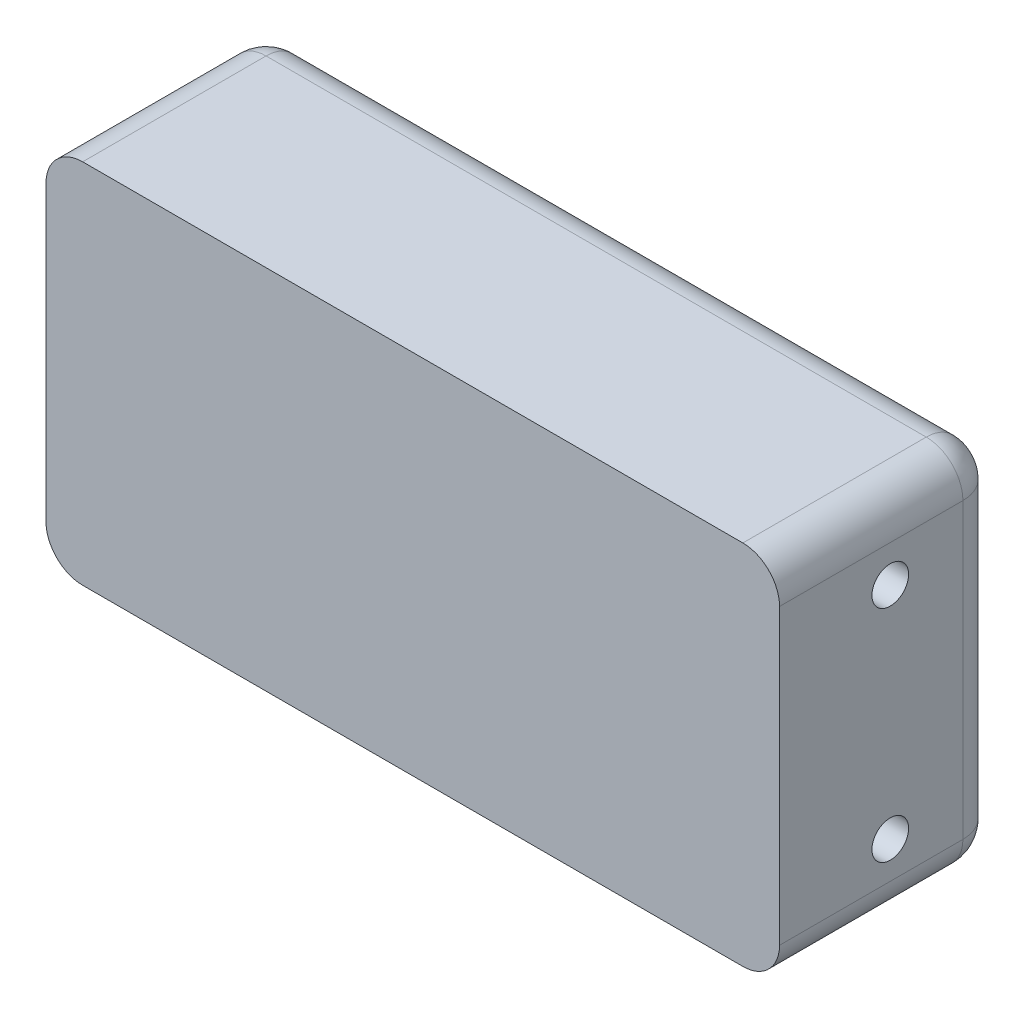
ISO-10303-21;
HEADER;
FILE_DESCRIPTION(('STEP AP214'),'2;1');
FILE_NAME('part.step','',(''),(''),'','','');
FILE_SCHEMA(('AUTOMOTIVE_DESIGN { 1 0 10303 214 1 1 1 1 }'));
ENDSEC;
DATA;
#1=APPLICATION_CONTEXT('core data for automotive mechanical design processes');
#2=APPLICATION_PROTOCOL_DEFINITION('international standard','automotive_design',2000,#1);
#3=PRODUCT_CONTEXT('',#1,'mechanical');
#4=PRODUCT('Part','Part','',(#3));
#5=PRODUCT_RELATED_PRODUCT_CATEGORY('part','',(#4));
#6=PRODUCT_DEFINITION_FORMATION('','',#4);
#7=PRODUCT_DEFINITION_CONTEXT('part definition',#1,'design');
#8=PRODUCT_DEFINITION('design','',#6,#7);
#9=PRODUCT_DEFINITION_SHAPE('','',#8);
#10=(LENGTH_UNIT() NAMED_UNIT(*) SI_UNIT(.MILLI.,.METRE.));
#11=(NAMED_UNIT(*) PLANE_ANGLE_UNIT() SI_UNIT($,.RADIAN.));
#12=(NAMED_UNIT(*) SI_UNIT($,.STERADIAN.) SOLID_ANGLE_UNIT());
#13=UNCERTAINTY_MEASURE_WITH_UNIT(LENGTH_MEASURE(1.E-05),#10,'distance_accuracy_value','');
#14=(GEOMETRIC_REPRESENTATION_CONTEXT(3) GLOBAL_UNCERTAINTY_ASSIGNED_CONTEXT((#13)) GLOBAL_UNIT_ASSIGNED_CONTEXT((#10,
#11,#12)) REPRESENTATION_CONTEXT('',''));
#15=CARTESIAN_POINT('',(0.,0.,0.));
#16=DIRECTION('',(0.,0.,1.));
#17=DIRECTION('',(1.,0.,0.));
#18=AXIS2_PLACEMENT_3D('',#15,#16,#17);
#19=CARTESIAN_POINT('',(50.,25.,30.));
#20=DIRECTION('',(-1.,0.,0.));
#21=DIRECTION('',(0.,-1.,0.));
#22=AXIS2_PLACEMENT_3D('',#19,#20,#21);
#23=PLANE('',#22);
#24=CARTESIAN_POINT('',(50.,-15.,14.9035489173353));
#25=DIRECTION('',(1.,0.,0.));
#26=DIRECTION('',(0.,1.,0.));
#27=AXIS2_PLACEMENT_3D('',#24,#25,#26);
#28=CIRCLE('',#27,2.5);
#29=CARTESIAN_POINT('',(50.,-12.5,14.9035489173353));
#30=VERTEX_POINT('',#29);
#31=EDGE_CURVE('E158',#30,#30,#28,.T.);
#32=ORIENTED_EDGE('',*,*,#31,.F.);
#33=EDGE_LOOP('',(#32));
#34=FACE_BOUND('',#33,.T.);
#35=CARTESIAN_POINT('',(50.,15.,14.9035489173353));
#36=DIRECTION('',(1.,0.,0.));
#37=DIRECTION('',(0.,1.,0.));
#38=AXIS2_PLACEMENT_3D('',#35,#36,#37);
#39=CIRCLE('',#38,2.5);
#40=CARTESIAN_POINT('',(50.,17.5,14.9035489173353));
#41=VERTEX_POINT('',#40);
#42=EDGE_CURVE('E165',#41,#41,#39,.T.);
#43=ORIENTED_EDGE('',*,*,#42,.F.);
#44=EDGE_LOOP('',(#43));
#45=FACE_BOUND('',#44,.T.);
#46=DIRECTION('',(0.,1.,0.));
#47=VECTOR('',#46,1.);
#48=CARTESIAN_POINT('',(50.,25.,5.));
#49=LINE('',#48,#47);
#50=CARTESIAN_POINT('',(50.,-20.,5.));
#51=VERTEX_POINT('',#50);
#52=CARTESIAN_POINT('',(50.,20.,5.));
#53=VERTEX_POINT('',#52);
#54=EDGE_CURVE('E183',#51,#53,#49,.T.);
#55=ORIENTED_EDGE('',*,*,#54,.T.);
#56=DIRECTION('',(0.,0.,-1.));
#57=VECTOR('',#56,1.);
#58=CARTESIAN_POINT('',(50.,20.,30.));
#59=LINE('',#58,#57);
#60=CARTESIAN_POINT('',(50.,20.,30.));
#61=VERTEX_POINT('',#60);
#62=EDGE_CURVE('E232',#53,#61,#59,.F.);
#63=ORIENTED_EDGE('',*,*,#62,.T.);
#64=DIRECTION('',(0.,1.,0.));
#65=VECTOR('',#64,1.);
#66=CARTESIAN_POINT('',(50.,25.,30.));
#67=LINE('',#66,#65);
#68=CARTESIAN_POINT('',(50.,-20.,30.));
#69=VERTEX_POINT('',#68);
#70=EDGE_CURVE('E171',#69,#61,#67,.T.);
#71=ORIENTED_EDGE('',*,*,#70,.F.);
#72=DIRECTION('',(0.,0.,-1.));
#73=VECTOR('',#72,1.);
#74=CARTESIAN_POINT('',(50.,-20.,30.));
#75=LINE('',#74,#73);
#76=EDGE_CURVE('E230',#69,#51,#75,.T.);
#77=ORIENTED_EDGE('',*,*,#76,.T.);
#78=EDGE_LOOP('',(#55,#63,#71,#77));
#79=FACE_BOUND('',#78,.T.);
#80=ADVANCED_FACE('F35',(#34,#45,#79),#23,.F.);
#81=CARTESIAN_POINT('',(-50.,25.,30.));
#82=DIRECTION('',(0.,-1.,0.));
#83=DIRECTION('',(0.,0.,-1.));
#84=AXIS2_PLACEMENT_3D('',#81,#82,#83);
#85=PLANE('',#84);
#86=DIRECTION('',(-1.,0.,0.));
#87=VECTOR('',#86,1.);
#88=CARTESIAN_POINT('',(-50.,25.,30.));
#89=LINE('',#88,#87);
#90=CARTESIAN_POINT('',(45.,25.,30.));
#91=VERTEX_POINT('',#90);
#92=CARTESIAN_POINT('',(-45.,25.,30.));
#93=VERTEX_POINT('',#92);
#94=EDGE_CURVE('E176',#91,#93,#89,.T.);
#95=ORIENTED_EDGE('',*,*,#94,.F.);
#96=DIRECTION('',(0.,0.,-1.));
#97=VECTOR('',#96,1.);
#98=CARTESIAN_POINT('',(45.,25.,30.));
#99=LINE('',#98,#97);
#100=CARTESIAN_POINT('',(45.,25.,5.));
#101=VERTEX_POINT('',#100);
#102=EDGE_CURVE('E228',#91,#101,#99,.T.);
#103=ORIENTED_EDGE('',*,*,#102,.T.);
#104=DIRECTION('',(-1.,0.,0.));
#105=VECTOR('',#104,1.);
#106=CARTESIAN_POINT('',(-50.,25.,5.));
#107=LINE('',#106,#105);
#108=CARTESIAN_POINT('',(-45.,25.,5.));
#109=VERTEX_POINT('',#108);
#110=EDGE_CURVE('E203',#101,#109,#107,.T.);
#111=ORIENTED_EDGE('',*,*,#110,.T.);
#112=DIRECTION('',(0.,0.,-1.));
#113=VECTOR('',#112,1.);
#114=CARTESIAN_POINT('',(-45.,25.,30.));
#115=LINE('',#114,#113);
#116=EDGE_CURVE('E226',#109,#93,#115,.F.);
#117=ORIENTED_EDGE('',*,*,#116,.T.);
#118=EDGE_LOOP('',(#95,#103,#111,#117));
#119=FACE_BOUND('',#118,.T.);
#120=ADVANCED_FACE('F282',(#119),#85,.F.);
#121=CARTESIAN_POINT('',(-50.,25.,30.));
#122=DIRECTION('',(1.,0.,0.));
#123=DIRECTION('',(0.,1.,0.));
#124=AXIS2_PLACEMENT_3D('',#121,#122,#123);
#125=PLANE('',#124);
#126=CARTESIAN_POINT('',(-50.,-15.,14.9035489173353));
#127=DIRECTION('',(1.,0.,0.));
#128=DIRECTION('',(0.,1.,0.));
#129=AXIS2_PLACEMENT_3D('',#126,#127,#128);
#130=CIRCLE('',#129,2.5);
#131=CARTESIAN_POINT('',(-50.,-12.5,14.9035489173353));
#132=VERTEX_POINT('',#131);
#133=EDGE_CURVE('E162',#132,#132,#130,.T.);
#134=ORIENTED_EDGE('',*,*,#133,.T.);
#135=EDGE_LOOP('',(#134));
#136=FACE_BOUND('',#135,.T.);
#137=CARTESIAN_POINT('',(-50.,15.,14.9035489173353));
#138=DIRECTION('',(1.,0.,0.));
#139=DIRECTION('',(0.,1.,0.));
#140=AXIS2_PLACEMENT_3D('',#137,#138,#139);
#141=CIRCLE('',#140,2.5);
#142=CARTESIAN_POINT('',(-50.,17.5,14.9035489173353));
#143=VERTEX_POINT('',#142);
#144=EDGE_CURVE('E168',#143,#143,#141,.T.);
#145=ORIENTED_EDGE('',*,*,#144,.T.);
#146=EDGE_LOOP('',(#145));
#147=FACE_BOUND('',#146,.T.);
#148=DIRECTION('',(0.,-1.,0.));
#149=VECTOR('',#148,1.);
#150=CARTESIAN_POINT('',(-50.,25.,30.));
#151=LINE('',#150,#149);
#152=CARTESIAN_POINT('',(-50.,20.,30.));
#153=VERTEX_POINT('',#152);
#154=CARTESIAN_POINT('',(-50.,-20.,30.));
#155=VERTEX_POINT('',#154);
#156=EDGE_CURVE('E179',#153,#155,#151,.T.);
#157=ORIENTED_EDGE('',*,*,#156,.F.);
#158=DIRECTION('',(0.,0.,-1.));
#159=VECTOR('',#158,1.);
#160=CARTESIAN_POINT('',(-50.,20.,30.));
#161=LINE('',#160,#159);
#162=CARTESIAN_POINT('',(-50.,20.,5.));
#163=VERTEX_POINT('',#162);
#164=EDGE_CURVE('E11',#153,#163,#161,.T.);
#165=ORIENTED_EDGE('',*,*,#164,.T.);
#166=DIRECTION('',(0.,-1.,0.));
#167=VECTOR('',#166,1.);
#168=CARTESIAN_POINT('',(-50.,25.,5.));
#169=LINE('',#168,#167);
#170=CARTESIAN_POINT('',(-50.,-20.,5.));
#171=VERTEX_POINT('',#170);
#172=EDGE_CURVE('E200',#163,#171,#169,.T.);
#173=ORIENTED_EDGE('',*,*,#172,.T.);
#174=DIRECTION('',(0.,0.,-1.));
#175=VECTOR('',#174,1.);
#176=CARTESIAN_POINT('',(-50.,-20.,30.));
#177=LINE('',#176,#175);
#178=EDGE_CURVE('E44',#171,#155,#177,.F.);
#179=ORIENTED_EDGE('',*,*,#178,.T.);
#180=EDGE_LOOP('',(#157,#165,#173,#179));
#181=FACE_BOUND('',#180,.T.);
#182=ADVANCED_FACE('F264',(#136,#147,#181),#125,.F.);
#183=CARTESIAN_POINT('',(-50.,-25.,30.));
#184=DIRECTION('',(0.,1.,0.));
#185=DIRECTION('',(0.,0.,1.));
#186=AXIS2_PLACEMENT_3D('',#183,#184,#185);
#187=PLANE('',#186);
#188=DIRECTION('',(1.,0.,0.));
#189=VECTOR('',#188,1.);
#190=CARTESIAN_POINT('',(-50.,-25.,5.));
#191=LINE('',#190,#189);
#192=CARTESIAN_POINT('',(-45.,-25.,5.));
#193=VERTEX_POINT('',#192);
#194=CARTESIAN_POINT('',(45.,-25.,5.));
#195=VERTEX_POINT('',#194);
#196=EDGE_CURVE('E198',#193,#195,#191,.T.);
#197=ORIENTED_EDGE('',*,*,#196,.T.);
#198=DIRECTION('',(0.,0.,-1.));
#199=VECTOR('',#198,1.);
#200=CARTESIAN_POINT('',(45.,-25.,30.));
#201=LINE('',#200,#199);
#202=CARTESIAN_POINT('',(45.,-25.,30.));
#203=VERTEX_POINT('',#202);
#204=EDGE_CURVE('E52',#195,#203,#201,.F.);
#205=ORIENTED_EDGE('',*,*,#204,.T.);
#206=DIRECTION('',(1.,0.,0.));
#207=VECTOR('',#206,1.);
#208=CARTESIAN_POINT('',(-50.,-25.,30.));
#209=LINE('',#208,#207);
#210=CARTESIAN_POINT('',(-45.,-25.,30.));
#211=VERTEX_POINT('',#210);
#212=EDGE_CURVE('E181',#211,#203,#209,.T.);
#213=ORIENTED_EDGE('',*,*,#212,.F.);
#214=DIRECTION('',(0.,0.,-1.));
#215=VECTOR('',#214,1.);
#216=CARTESIAN_POINT('',(-45.,-25.,30.));
#217=LINE('',#216,#215);
#218=EDGE_CURVE('E241',#211,#193,#217,.T.);
#219=ORIENTED_EDGE('',*,*,#218,.T.);
#220=EDGE_LOOP('',(#197,#205,#213,#219));
#221=FACE_BOUND('',#220,.T.);
#222=ADVANCED_FACE('F305',(#221),#187,.F.);
#223=CARTESIAN_POINT('',(0.,0.,30.));
#224=DIRECTION('',(0.,0.,1.));
#225=DIRECTION('',(1.,0.,0.));
#226=AXIS2_PLACEMENT_3D('',#223,#224,#225);
#227=PLANE('',#226);
#228=ORIENTED_EDGE('',*,*,#70,.T.);
#229=CARTESIAN_POINT('',(45.,20.,30.));
#230=DIRECTION('',(0.,0.,1.));
#231=DIRECTION('',(1.,0.,0.));
#232=AXIS2_PLACEMENT_3D('',#229,#230,#231);
#233=CIRCLE('',#232,5.);
#234=EDGE_CURVE('E239',#61,#91,#233,.T.);
#235=ORIENTED_EDGE('',*,*,#234,.T.);
#236=ORIENTED_EDGE('',*,*,#94,.T.);
#237=CARTESIAN_POINT('',(-45.,20.,30.));
#238=DIRECTION('',(0.,0.,1.));
#239=DIRECTION('',(1.,0.,0.));
#240=AXIS2_PLACEMENT_3D('',#237,#238,#239);
#241=CIRCLE('',#240,5.);
#242=EDGE_CURVE('E235',#93,#153,#241,.T.);
#243=ORIENTED_EDGE('',*,*,#242,.T.);
#244=ORIENTED_EDGE('',*,*,#156,.T.);
#245=CARTESIAN_POINT('',(-45.,-20.,30.));
#246=DIRECTION('',(0.,0.,1.));
#247=DIRECTION('',(1.,0.,0.));
#248=AXIS2_PLACEMENT_3D('',#245,#246,#247);
#249=CIRCLE('',#248,5.);
#250=EDGE_CURVE('E59',#155,#211,#249,.T.);
#251=ORIENTED_EDGE('',*,*,#250,.T.);
#252=ORIENTED_EDGE('',*,*,#212,.T.);
#253=CARTESIAN_POINT('',(45.,-20.,30.));
#254=DIRECTION('',(0.,0.,1.));
#255=DIRECTION('',(1.,0.,0.));
#256=AXIS2_PLACEMENT_3D('',#253,#254,#255);
#257=CIRCLE('',#256,5.);
#258=EDGE_CURVE('E237',#203,#69,#257,.T.);
#259=ORIENTED_EDGE('',*,*,#258,.T.);
#260=EDGE_LOOP('',(#228,#235,#236,#243,#244,#251,#252,#259));
#261=FACE_BOUND('',#260,.T.);
#262=ADVANCED_FACE('F267',(#261),#227,.T.);
#263=CARTESIAN_POINT('',(0.,0.,0.));
#264=DIRECTION('',(0.,0.,1.));
#265=DIRECTION('',(1.,0.,0.));
#266=AXIS2_PLACEMENT_3D('',#263,#264,#265);
#267=PLANE('',#266);
#268=CARTESIAN_POINT('',(0.,15.,0.));
#269=DIRECTION('',(0.,0.,-1.));
#270=DIRECTION('',(-1.,0.,0.));
#271=AXIS2_PLACEMENT_3D('',#268,#269,#270);
#272=CIRCLE('',#271,2.5);
#273=CARTESIAN_POINT('',(-2.49999999999998,15.,0.));
#274=VERTEX_POINT('',#273);
#275=EDGE_CURVE('E142',#274,#274,#272,.T.);
#276=ORIENTED_EDGE('',*,*,#275,.F.);
#277=EDGE_LOOP('',(#276));
#278=FACE_BOUND('',#277,.T.);
#279=CARTESIAN_POINT('',(-30.,15.,0.));
#280=DIRECTION('',(0.,0.,-1.));
#281=DIRECTION('',(-1.,0.,0.));
#282=AXIS2_PLACEMENT_3D('',#279,#280,#281);
#283=CIRCLE('',#282,2.5);
#284=CARTESIAN_POINT('',(-32.5,15.,0.));
#285=VERTEX_POINT('',#284);
#286=EDGE_CURVE('E148',#285,#285,#283,.T.);
#287=ORIENTED_EDGE('',*,*,#286,.F.);
#288=EDGE_LOOP('',(#287));
#289=FACE_BOUND('',#288,.T.);
#290=CARTESIAN_POINT('',(30.,15.,0.));
#291=DIRECTION('',(0.,0.,-1.));
#292=DIRECTION('',(-1.,0.,0.));
#293=AXIS2_PLACEMENT_3D('',#290,#291,#292);
#294=CIRCLE('',#293,2.5);
#295=CARTESIAN_POINT('',(27.5,15.,0.));
#296=VERTEX_POINT('',#295);
#297=EDGE_CURVE('E155',#296,#296,#294,.T.);
#298=ORIENTED_EDGE('',*,*,#297,.F.);
#299=EDGE_LOOP('',(#298));
#300=FACE_BOUND('',#299,.T.);
#301=DIRECTION('',(-1.,0.,0.));
#302=VECTOR('',#301,1.);
#303=CARTESIAN_POINT('',(0.,20.,0.));
#304=LINE('',#303,#302);
#305=CARTESIAN_POINT('',(-45.,20.,0.));
#306=VERTEX_POINT('',#305);
#307=CARTESIAN_POINT('',(45.,20.,0.));
#308=VERTEX_POINT('',#307);
#309=EDGE_CURVE('E186',#306,#308,#304,.F.);
#310=ORIENTED_EDGE('',*,*,#309,.T.);
#311=DIRECTION('',(0.,1.,0.));
#312=VECTOR('',#311,1.);
#313=CARTESIAN_POINT('',(45.,0.,0.));
#314=LINE('',#313,#312);
#315=CARTESIAN_POINT('',(45.,-20.,0.));
#316=VERTEX_POINT('',#315);
#317=EDGE_CURVE('E195',#308,#316,#314,.F.);
#318=ORIENTED_EDGE('',*,*,#317,.T.);
#319=DIRECTION('',(1.,0.,0.));
#320=VECTOR('',#319,1.);
#321=CARTESIAN_POINT('',(0.,-20.,0.));
#322=LINE('',#321,#320);
#323=CARTESIAN_POINT('',(-45.,-20.,0.));
#324=VERTEX_POINT('',#323);
#325=EDGE_CURVE('E192',#316,#324,#322,.F.);
#326=ORIENTED_EDGE('',*,*,#325,.T.);
#327=DIRECTION('',(0.,-1.,0.));
#328=VECTOR('',#327,1.);
#329=CARTESIAN_POINT('',(-45.,0.,0.));
#330=LINE('',#329,#328);
#331=EDGE_CURVE('E189',#324,#306,#330,.F.);
#332=ORIENTED_EDGE('',*,*,#331,.T.);
#333=EDGE_LOOP('',(#310,#318,#326,#332));
#334=FACE_BOUND('',#333,.T.);
#335=ADVANCED_FACE('F294',(#278,#289,#300,#334),#267,.F.);
#336=CARTESIAN_POINT('',(-50.,15.,14.9035489173353));
#337=DIRECTION('',(1.,0.,0.));
#338=DIRECTION('',(0.,1.,0.));
#339=AXIS2_PLACEMENT_3D('',#336,#337,#338);
#340=CYLINDRICAL_SURFACE('',#339,2.5);
#341=CARTESIAN_POINT('',(0.,15.,14.9035489173353));
#342=DIRECTION('',(-0.707106781186547,0.,-0.707106781186547));
#343=DIRECTION('',(0.707106781186547,0.,-0.707106781186547));
#344=AXIS2_PLACEMENT_3D('',#341,#342,#343);
#345=ELLIPSE('',#344,3.53553390593274,2.5);
#346=CARTESIAN_POINT('',(0.,12.5,14.9035489173353));
#347=VERTEX_POINT('',#346);
#348=CARTESIAN_POINT('',(0.,17.5,14.9035489173353));
#349=VERTEX_POINT('',#348);
#350=EDGE_CURVE('E132',#347,#349,#345,.F.);
#351=ORIENTED_EDGE('',*,*,#350,.F.);
#352=CARTESIAN_POINT('',(0.,15.,14.9035489173353));
#353=DIRECTION('',(0.707106781186547,0.,-0.707106781186547));
#354=DIRECTION('',(-0.707106781186547,0.,-0.707106781186547));
#355=AXIS2_PLACEMENT_3D('',#352,#353,#354);
#356=ELLIPSE('',#355,3.53553390593274,2.5);
#357=EDGE_CURVE('E136',#349,#347,#356,.F.);
#358=ORIENTED_EDGE('',*,*,#357,.F.);
#359=EDGE_LOOP('',(#351,#358));
#360=FACE_BOUND('',#359,.T.);
#361=CARTESIAN_POINT('',(-30.,15.,14.9035489173353));
#362=DIRECTION('',(-0.707106781186547,0.,-0.707106781186547));
#363=DIRECTION('',(0.707106781186547,0.,-0.707106781186547));
#364=AXIS2_PLACEMENT_3D('',#361,#362,#363);
#365=ELLIPSE('',#364,3.53553390593274,2.5);
#366=CARTESIAN_POINT('',(-30.,12.5,14.9035489173353));
#367=VERTEX_POINT('',#366);
#368=CARTESIAN_POINT('',(-30.,17.5,14.9035489173353));
#369=VERTEX_POINT('',#368);
#370=EDGE_CURVE('E145',#367,#369,#365,.F.);
#371=ORIENTED_EDGE('',*,*,#370,.F.);
#372=CARTESIAN_POINT('',(-30.,15.,14.9035489173353));
#373=DIRECTION('',(0.707106781186547,0.,-0.707106781186547));
#374=DIRECTION('',(-0.707106781186547,0.,-0.707106781186547));
#375=AXIS2_PLACEMENT_3D('',#372,#373,#374);
#376=ELLIPSE('',#375,3.53553390593274,2.5);
#377=EDGE_CURVE('E152',#369,#367,#376,.F.);
#378=ORIENTED_EDGE('',*,*,#377,.F.);
#379=EDGE_LOOP('',(#371,#378));
#380=FACE_BOUND('',#379,.T.);
#381=CARTESIAN_POINT('',(30.,15.,14.9035489173353));
#382=DIRECTION('',(-0.707106781186547,0.,-0.707106781186547));
#383=DIRECTION('',(0.707106781186547,0.,-0.707106781186547));
#384=AXIS2_PLACEMENT_3D('',#381,#382,#383);
#385=ELLIPSE('',#384,3.53553390593274,2.5);
#386=CARTESIAN_POINT('',(30.,12.5,14.9035489173353));
#387=VERTEX_POINT('',#386);
#388=CARTESIAN_POINT('',(30.,17.5,14.9035489173353));
#389=VERTEX_POINT('',#388);
#390=EDGE_CURVE('E151',#387,#389,#385,.F.);
#391=ORIENTED_EDGE('',*,*,#390,.F.);
#392=CARTESIAN_POINT('',(30.,15.,14.9035489173353));
#393=DIRECTION('',(0.707106781186547,0.,-0.707106781186547));
#394=DIRECTION('',(-0.707106781186547,0.,-0.707106781186547));
#395=AXIS2_PLACEMENT_3D('',#392,#393,#394);
#396=ELLIPSE('',#395,3.53553390593274,2.5);
#397=EDGE_CURVE('E159',#389,#387,#396,.F.);
#398=ORIENTED_EDGE('',*,*,#397,.F.);
#399=EDGE_LOOP('',(#391,#398));
#400=FACE_BOUND('',#399,.T.);
#401=ORIENTED_EDGE('',*,*,#144,.F.);
#402=EDGE_LOOP('',(#401));
#403=FACE_BOUND('',#402,.T.);
#404=ORIENTED_EDGE('',*,*,#42,.T.);
#405=EDGE_LOOP('',(#404));
#406=FACE_BOUND('',#405,.T.);
#407=ADVANCED_FACE('F140',(#360,#380,#400,#403,#406),#340,.F.);
#408=CARTESIAN_POINT('',(-50.,-15.,14.9035489173353));
#409=DIRECTION('',(1.,0.,0.));
#410=DIRECTION('',(0.,1.,0.));
#411=AXIS2_PLACEMENT_3D('',#408,#409,#410);
#412=CYLINDRICAL_SURFACE('',#411,2.5);
#413=ORIENTED_EDGE('',*,*,#133,.F.);
#414=EDGE_LOOP('',(#413));
#415=FACE_BOUND('',#414,.T.);
#416=ORIENTED_EDGE('',*,*,#31,.T.);
#417=EDGE_LOOP('',(#416));
#418=FACE_BOUND('',#417,.T.);
#419=ADVANCED_FACE('F340',(#415,#418),#412,.F.);
#420=CARTESIAN_POINT('',(-45.,25.,5.));
#421=DIRECTION('',(0.,-1.,0.));
#422=DIRECTION('',(1.,0.,0.));
#423=AXIS2_PLACEMENT_3D('',#420,#421,#422);
#424=CYLINDRICAL_SURFACE('',#423,5.);
#425=ORIENTED_EDGE('',*,*,#172,.F.);
#426=CARTESIAN_POINT('',(-45.,20.,5.));
#427=DIRECTION('',(0.,-1.,0.));
#428=DIRECTION('',(1.,0.,0.));
#429=AXIS2_PLACEMENT_3D('',#426,#427,#428);
#430=CIRCLE('',#429,5.);
#431=EDGE_CURVE('E224',#163,#306,#430,.T.);
#432=ORIENTED_EDGE('',*,*,#431,.T.);
#433=ORIENTED_EDGE('',*,*,#331,.F.);
#434=CARTESIAN_POINT('',(-45.,-20.,5.));
#435=DIRECTION('',(0.,-1.,0.));
#436=DIRECTION('',(1.,0.,0.));
#437=AXIS2_PLACEMENT_3D('',#434,#435,#436);
#438=CIRCLE('',#437,5.);
#439=EDGE_CURVE('E222',#324,#171,#438,.F.);
#440=ORIENTED_EDGE('',*,*,#439,.T.);
#441=EDGE_LOOP('',(#425,#432,#433,#440));
#442=FACE_BOUND('',#441,.T.);
#443=ADVANCED_FACE('F273',(#442),#424,.T.);
#444=CARTESIAN_POINT('',(-50.,-20.,5.));
#445=DIRECTION('',(1.,0.,0.));
#446=DIRECTION('',(0.,0.,-1.));
#447=AXIS2_PLACEMENT_3D('',#444,#445,#446);
#448=CYLINDRICAL_SURFACE('',#447,5.);
#449=ORIENTED_EDGE('',*,*,#325,.F.);
#450=CARTESIAN_POINT('',(45.,-20.,5.));
#451=DIRECTION('',(1.,0.,0.));
#452=DIRECTION('',(0.,0.,-1.));
#453=AXIS2_PLACEMENT_3D('',#450,#451,#452);
#454=CIRCLE('',#453,5.);
#455=EDGE_CURVE('E220',#316,#195,#454,.F.);
#456=ORIENTED_EDGE('',*,*,#455,.T.);
#457=ORIENTED_EDGE('',*,*,#196,.F.);
#458=CARTESIAN_POINT('',(-45.,-20.,5.));
#459=DIRECTION('',(1.,0.,0.));
#460=DIRECTION('',(0.,0.,-1.));
#461=AXIS2_PLACEMENT_3D('',#458,#459,#460);
#462=CIRCLE('',#461,5.);
#463=EDGE_CURVE('E217',#193,#324,#462,.T.);
#464=ORIENTED_EDGE('',*,*,#463,.T.);
#465=EDGE_LOOP('',(#449,#456,#457,#464));
#466=FACE_BOUND('',#465,.T.);
#467=ADVANCED_FACE('F303',(#466),#448,.T.);
#468=CARTESIAN_POINT('',(-50.,20.,5.));
#469=DIRECTION('',(-1.,0.,0.));
#470=DIRECTION('',(0.,0.,1.));
#471=AXIS2_PLACEMENT_3D('',#468,#469,#470);
#472=CYLINDRICAL_SURFACE('',#471,5.);
#473=ORIENTED_EDGE('',*,*,#110,.F.);
#474=CARTESIAN_POINT('',(45.,20.,5.));
#475=DIRECTION('',(-1.,0.,0.));
#476=DIRECTION('',(0.,0.,1.));
#477=AXIS2_PLACEMENT_3D('',#474,#475,#476);
#478=CIRCLE('',#477,5.);
#479=EDGE_CURVE('E215',#101,#308,#478,.T.);
#480=ORIENTED_EDGE('',*,*,#479,.T.);
#481=ORIENTED_EDGE('',*,*,#309,.F.);
#482=CARTESIAN_POINT('',(-45.,20.,5.));
#483=DIRECTION('',(-1.,0.,0.));
#484=DIRECTION('',(0.,0.,1.));
#485=AXIS2_PLACEMENT_3D('',#482,#483,#484);
#486=CIRCLE('',#485,5.);
#487=EDGE_CURVE('E212',#306,#109,#486,.F.);
#488=ORIENTED_EDGE('',*,*,#487,.T.);
#489=EDGE_LOOP('',(#473,#480,#481,#488));
#490=FACE_BOUND('',#489,.T.);
#491=ADVANCED_FACE('F279',(#490),#472,.T.);
#492=CARTESIAN_POINT('',(45.,25.,5.));
#493=DIRECTION('',(0.,1.,0.));
#494=DIRECTION('',(-1.,0.,0.));
#495=AXIS2_PLACEMENT_3D('',#492,#493,#494);
#496=CYLINDRICAL_SURFACE('',#495,5.);
#497=ORIENTED_EDGE('',*,*,#317,.F.);
#498=CARTESIAN_POINT('',(45.,20.,5.));
#499=DIRECTION('',(0.,1.,0.));
#500=DIRECTION('',(-1.,0.,0.));
#501=AXIS2_PLACEMENT_3D('',#498,#499,#500);
#502=CIRCLE('',#501,5.);
#503=EDGE_CURVE('E209',#308,#53,#502,.F.);
#504=ORIENTED_EDGE('',*,*,#503,.T.);
#505=ORIENTED_EDGE('',*,*,#54,.F.);
#506=CARTESIAN_POINT('',(45.,-20.,5.));
#507=DIRECTION('',(0.,1.,0.));
#508=DIRECTION('',(-1.,0.,0.));
#509=AXIS2_PLACEMENT_3D('',#506,#507,#508);
#510=CIRCLE('',#509,5.);
#511=EDGE_CURVE('E206',#51,#316,#510,.T.);
#512=ORIENTED_EDGE('',*,*,#511,.T.);
#513=EDGE_LOOP('',(#497,#504,#505,#512));
#514=FACE_BOUND('',#513,.T.);
#515=ADVANCED_FACE('F296',(#514),#496,.T.);
#516=CARTESIAN_POINT('',(30.,15.,30.001));
#517=DIRECTION('',(0.,0.,-1.));
#518=DIRECTION('',(-1.,0.,0.));
#519=AXIS2_PLACEMENT_3D('',#516,#517,#518);
#520=CYLINDRICAL_SURFACE('',#519,2.5);
#521=ORIENTED_EDGE('',*,*,#397,.T.);
#522=ORIENTED_EDGE('',*,*,#390,.T.);
#523=EDGE_LOOP('',(#521,#522));
#524=FACE_BOUND('',#523,.T.);
#525=ORIENTED_EDGE('',*,*,#297,.T.);
#526=EDGE_LOOP('',(#525));
#527=FACE_BOUND('',#526,.T.);
#528=ADVANCED_FACE('F333',(#524,#527),#520,.F.);
#529=CARTESIAN_POINT('',(-30.,15.,30.001));
#530=DIRECTION('',(0.,0.,-1.));
#531=DIRECTION('',(-1.,0.,0.));
#532=AXIS2_PLACEMENT_3D('',#529,#530,#531);
#533=CYLINDRICAL_SURFACE('',#532,2.5);
#534=ORIENTED_EDGE('',*,*,#377,.T.);
#535=ORIENTED_EDGE('',*,*,#370,.T.);
#536=EDGE_LOOP('',(#534,#535));
#537=FACE_BOUND('',#536,.T.);
#538=ORIENTED_EDGE('',*,*,#286,.T.);
#539=EDGE_LOOP('',(#538));
#540=FACE_BOUND('',#539,.T.);
#541=ADVANCED_FACE('F346',(#537,#540),#533,.F.);
#542=CARTESIAN_POINT('',(0.,15.,30.001));
#543=DIRECTION('',(0.,0.,-1.));
#544=DIRECTION('',(-1.,0.,0.));
#545=AXIS2_PLACEMENT_3D('',#542,#543,#544);
#546=CYLINDRICAL_SURFACE('',#545,2.5);
#547=ORIENTED_EDGE('',*,*,#357,.T.);
#548=ORIENTED_EDGE('',*,*,#350,.T.);
#549=EDGE_LOOP('',(#547,#548));
#550=FACE_BOUND('',#549,.T.);
#551=ORIENTED_EDGE('',*,*,#275,.T.);
#552=EDGE_LOOP('',(#551));
#553=FACE_BOUND('',#552,.T.);
#554=ADVANCED_FACE('F134',(#550,#553),#546,.F.);
#555=CARTESIAN_POINT('',(45.,20.,30.));
#556=DIRECTION('',(0.,0.,-1.));
#557=DIRECTION('',(-1.,0.,0.));
#558=AXIS2_PLACEMENT_3D('',#555,#556,#557);
#559=CYLINDRICAL_SURFACE('',#558,5.);
#560=ORIENTED_EDGE('',*,*,#234,.F.);
#561=ORIENTED_EDGE('',*,*,#62,.F.);
#562=CARTESIAN_POINT('',(45.,20.,5.));
#563=DIRECTION('',(0.,0.,-1.));
#564=DIRECTION('',(-1.,0.,0.));
#565=AXIS2_PLACEMENT_3D('',#562,#563,#564);
#566=CIRCLE('',#565,5.);
#567=EDGE_CURVE('E138',#101,#53,#566,.T.);
#568=ORIENTED_EDGE('',*,*,#567,.F.);
#569=ORIENTED_EDGE('',*,*,#102,.F.);
#570=EDGE_LOOP('',(#560,#561,#568,#569));
#571=FACE_BOUND('',#570,.T.);
#572=ADVANCED_FACE('F287',(#571),#559,.T.);
#573=CARTESIAN_POINT('',(45.,20.,5.));
#574=DIRECTION('',(0.,0.,1.));
#575=DIRECTION('',(1.,0.,0.));
#576=AXIS2_PLACEMENT_3D('',#573,#574,#575);
#577=SPHERICAL_SURFACE('',#576,5.);
#578=ORIENTED_EDGE('',*,*,#503,.F.);
#579=ORIENTED_EDGE('',*,*,#479,.F.);
#580=ORIENTED_EDGE('',*,*,#567,.T.);
#581=EDGE_LOOP('',(#578,#579,#580));
#582=FACE_BOUND('',#581,.T.);
#583=ADVANCED_FACE('F291',(#582),#577,.T.);
#584=CARTESIAN_POINT('',(45.,-20.,30.));
#585=DIRECTION('',(0.,0.,-1.));
#586=DIRECTION('',(-1.,0.,0.));
#587=AXIS2_PLACEMENT_3D('',#584,#585,#586);
#588=CYLINDRICAL_SURFACE('',#587,5.);
#589=ORIENTED_EDGE('',*,*,#258,.F.);
#590=ORIENTED_EDGE('',*,*,#204,.F.);
#591=CARTESIAN_POINT('',(45.,-20.,5.));
#592=DIRECTION('',(0.,0.,-1.));
#593=DIRECTION('',(-1.,0.,0.));
#594=AXIS2_PLACEMENT_3D('',#591,#592,#593);
#595=CIRCLE('',#594,5.);
#596=EDGE_CURVE('E246',#51,#195,#595,.T.);
#597=ORIENTED_EDGE('',*,*,#596,.F.);
#598=ORIENTED_EDGE('',*,*,#76,.F.);
#599=EDGE_LOOP('',(#589,#590,#597,#598));
#600=FACE_BOUND('',#599,.T.);
#601=ADVANCED_FACE('F308',(#600),#588,.T.);
#602=CARTESIAN_POINT('',(45.,-20.,5.));
#603=DIRECTION('',(0.,0.,1.));
#604=DIRECTION('',(1.,0.,0.));
#605=AXIS2_PLACEMENT_3D('',#602,#603,#604);
#606=SPHERICAL_SURFACE('',#605,5.);
#607=ORIENTED_EDGE('',*,*,#596,.T.);
#608=ORIENTED_EDGE('',*,*,#455,.F.);
#609=ORIENTED_EDGE('',*,*,#511,.F.);
#610=EDGE_LOOP('',(#607,#608,#609));
#611=FACE_BOUND('',#610,.T.);
#612=ADVANCED_FACE('F310',(#611),#606,.T.);
#613=CARTESIAN_POINT('',(-45.,20.,30.));
#614=DIRECTION('',(0.,0.,-1.));
#615=DIRECTION('',(-1.,0.,0.));
#616=AXIS2_PLACEMENT_3D('',#613,#614,#615);
#617=CYLINDRICAL_SURFACE('',#616,5.);
#618=ORIENTED_EDGE('',*,*,#242,.F.);
#619=ORIENTED_EDGE('',*,*,#116,.F.);
#620=CARTESIAN_POINT('',(-45.,20.,5.));
#621=DIRECTION('',(0.,0.,-1.));
#622=DIRECTION('',(-1.,0.,0.));
#623=AXIS2_PLACEMENT_3D('',#620,#621,#622);
#624=CIRCLE('',#623,5.);
#625=EDGE_CURVE('E248',#163,#109,#624,.T.);
#626=ORIENTED_EDGE('',*,*,#625,.F.);
#627=ORIENTED_EDGE('',*,*,#164,.F.);
#628=EDGE_LOOP('',(#618,#619,#626,#627));
#629=FACE_BOUND('',#628,.T.);
#630=ADVANCED_FACE('F271',(#629),#617,.T.);
#631=CARTESIAN_POINT('',(-45.,20.,5.));
#632=DIRECTION('',(0.,0.,1.));
#633=DIRECTION('',(1.,0.,0.));
#634=AXIS2_PLACEMENT_3D('',#631,#632,#633);
#635=SPHERICAL_SURFACE('',#634,5.);
#636=ORIENTED_EDGE('',*,*,#487,.F.);
#637=ORIENTED_EDGE('',*,*,#431,.F.);
#638=ORIENTED_EDGE('',*,*,#625,.T.);
#639=EDGE_LOOP('',(#636,#637,#638));
#640=FACE_BOUND('',#639,.T.);
#641=ADVANCED_FACE('F275',(#640),#635,.T.);
#642=CARTESIAN_POINT('',(-45.,-20.,30.));
#643=DIRECTION('',(0.,0.,-1.));
#644=DIRECTION('',(-1.,0.,0.));
#645=AXIS2_PLACEMENT_3D('',#642,#643,#644);
#646=CYLINDRICAL_SURFACE('',#645,5.);
#647=ORIENTED_EDGE('',*,*,#250,.F.);
#648=ORIENTED_EDGE('',*,*,#178,.F.);
#649=CARTESIAN_POINT('',(-45.,-20.,5.));
#650=DIRECTION('',(0.,0.,-1.));
#651=DIRECTION('',(-1.,0.,0.));
#652=AXIS2_PLACEMENT_3D('',#649,#650,#651);
#653=CIRCLE('',#652,5.);
#654=EDGE_CURVE('E39',#193,#171,#653,.T.);
#655=ORIENTED_EDGE('',*,*,#654,.F.);
#656=ORIENTED_EDGE('',*,*,#218,.F.);
#657=EDGE_LOOP('',(#647,#648,#655,#656));
#658=FACE_BOUND('',#657,.T.);
#659=ADVANCED_FACE('F37',(#658),#646,.T.);
#660=CARTESIAN_POINT('',(-45.,-20.,5.));
#661=DIRECTION('',(0.,0.,1.));
#662=DIRECTION('',(1.,0.,0.));
#663=AXIS2_PLACEMENT_3D('',#660,#661,#662);
#664=SPHERICAL_SURFACE('',#663,5.);
#665=ORIENTED_EDGE('',*,*,#654,.T.);
#666=ORIENTED_EDGE('',*,*,#439,.F.);
#667=ORIENTED_EDGE('',*,*,#463,.F.);
#668=EDGE_LOOP('',(#665,#666,#667));
#669=FACE_BOUND('',#668,.T.);
#670=ADVANCED_FACE('F258',(#669),#664,.T.);
#671=CLOSED_SHELL('',(#80,#120,#182,#222,#262,#335,#407,#419,#443,#467,#491,#515,#528,#541,#554,
#572,#583,#601,#612,#630,#641,#659,#670));
#672=MANIFOLD_SOLID_BREP('B2',#671);
#673=ADVANCED_BREP_SHAPE_REPRESENTATION('',(#18,#672),#14);
#674=SHAPE_DEFINITION_REPRESENTATION(#9,#673);
ENDSEC;
END-ISO-10303-21;
